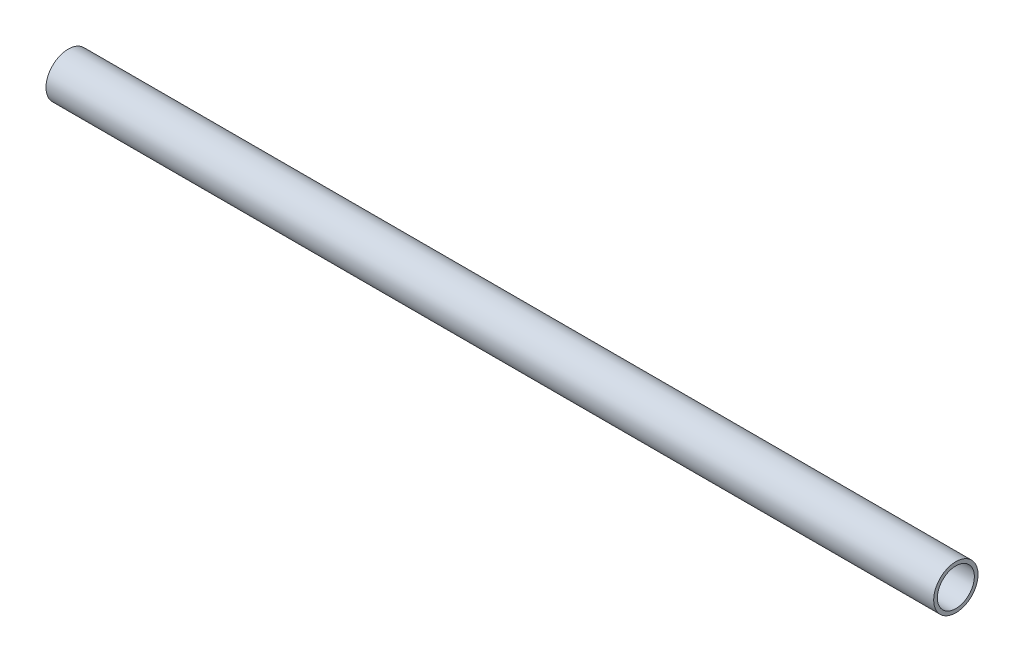
ISO-10303-21;
HEADER;
FILE_DESCRIPTION(('STEP AP214'),'2;1');
FILE_NAME('part.step','',(''),(''),'','','');
FILE_SCHEMA(('AUTOMOTIVE_DESIGN { 1 0 10303 214 1 1 1 1 }'));
ENDSEC;
DATA;
#1=APPLICATION_CONTEXT('core data for automotive mechanical design processes');
#2=APPLICATION_PROTOCOL_DEFINITION('international standard','automotive_design',2000,#1);
#3=PRODUCT_CONTEXT('',#1,'mechanical');
#4=PRODUCT('Part','Part','',(#3));
#5=PRODUCT_RELATED_PRODUCT_CATEGORY('part','',(#4));
#6=PRODUCT_DEFINITION_FORMATION('','',#4);
#7=PRODUCT_DEFINITION_CONTEXT('part definition',#1,'design');
#8=PRODUCT_DEFINITION('design','',#6,#7);
#9=PRODUCT_DEFINITION_SHAPE('','',#8);
#10=(LENGTH_UNIT() NAMED_UNIT(*) SI_UNIT(.MILLI.,.METRE.));
#11=(NAMED_UNIT(*) PLANE_ANGLE_UNIT() SI_UNIT($,.RADIAN.));
#12=(NAMED_UNIT(*) SI_UNIT($,.STERADIAN.) SOLID_ANGLE_UNIT());
#13=UNCERTAINTY_MEASURE_WITH_UNIT(LENGTH_MEASURE(1.E-05),#10,'distance_accuracy_value','');
#14=(GEOMETRIC_REPRESENTATION_CONTEXT(3) GLOBAL_UNCERTAINTY_ASSIGNED_CONTEXT((#13)) GLOBAL_UNIT_ASSIGNED_CONTEXT((#10,
#11,#12)) REPRESENTATION_CONTEXT('',''));
#15=CARTESIAN_POINT('',(0.,0.,0.));
#16=DIRECTION('',(0.,0.,1.));
#17=DIRECTION('',(1.,0.,0.));
#18=AXIS2_PLACEMENT_3D('',#15,#16,#17);
#19=CARTESIAN_POINT('',(0.,0.,-3.));
#20=DIRECTION('',(1.,0.,0.));
#21=DIRECTION('',(0.,0.,-1.));
#22=AXIS2_PLACEMENT_3D('',#19,#20,#21);
#23=PLANE('',#22);
#24=CARTESIAN_POINT('',(0.,0.,0.));
#25=DIRECTION('',(-1.,0.,0.));
#26=DIRECTION('',(0.,0.,1.));
#27=AXIS2_PLACEMENT_3D('',#24,#25,#26);
#28=CIRCLE('',#27,2.5);
#29=CARTESIAN_POINT('',(0.,0.,2.5));
#30=VERTEX_POINT('',#29);
#31=EDGE_CURVE('E10',#30,#30,#28,.T.);
#32=ORIENTED_EDGE('',*,*,#31,.F.);
#33=EDGE_LOOP('',(#32));
#34=FACE_BOUND('',#33,.T.);
#35=CARTESIAN_POINT('',(0.,0.,0.));
#36=DIRECTION('',(-1.,0.,0.));
#37=DIRECTION('',(0.,0.,1.));
#38=AXIS2_PLACEMENT_3D('',#35,#36,#37);
#39=CIRCLE('',#38,3.);
#40=CARTESIAN_POINT('',(0.,0.,3.));
#41=VERTEX_POINT('',#40);
#42=EDGE_CURVE('E45',#41,#41,#39,.T.);
#43=ORIENTED_EDGE('',*,*,#42,.T.);
#44=EDGE_LOOP('',(#43));
#45=FACE_BOUND('',#44,.T.);
#46=ADVANCED_FACE('F31',(#34,#45),#23,.F.);
#47=CARTESIAN_POINT('',(-0.956467940824351,0.,0.));
#48=DIRECTION('',(-1.,0.,0.));
#49=DIRECTION('',(0.,0.,1.));
#50=AXIS2_PLACEMENT_3D('',#47,#48,#49);
#51=CYLINDRICAL_SURFACE('',#50,2.5);
#52=CARTESIAN_POINT('',(120.,0.,0.));
#53=DIRECTION('',(-1.,0.,0.));
#54=DIRECTION('',(0.,0.,1.));
#55=AXIS2_PLACEMENT_3D('',#52,#53,#54);
#56=CIRCLE('',#55,2.5);
#57=CARTESIAN_POINT('',(120.,0.,2.5));
#58=VERTEX_POINT('',#57);
#59=EDGE_CURVE('E37',#58,#58,#56,.T.);
#60=ORIENTED_EDGE('',*,*,#59,.F.);
#61=EDGE_LOOP('',(#60));
#62=FACE_BOUND('',#61,.T.);
#63=ORIENTED_EDGE('',*,*,#31,.T.);
#64=EDGE_LOOP('',(#63));
#65=FACE_BOUND('',#64,.T.);
#66=ADVANCED_FACE('F60',(#62,#65),#51,.F.);
#67=CARTESIAN_POINT('',(120.,0.,-3.));
#68=DIRECTION('',(-1.,0.,0.));
#69=DIRECTION('',(0.,0.,1.));
#70=AXIS2_PLACEMENT_3D('',#67,#68,#69);
#71=PLANE('',#70);
#72=CARTESIAN_POINT('',(120.,0.,0.));
#73=DIRECTION('',(-1.,0.,0.));
#74=DIRECTION('',(0.,0.,1.));
#75=AXIS2_PLACEMENT_3D('',#72,#73,#74);
#76=CIRCLE('',#75,3.);
#77=CARTESIAN_POINT('',(120.,0.,3.));
#78=VERTEX_POINT('',#77);
#79=EDGE_CURVE('E41',#78,#78,#76,.T.);
#80=ORIENTED_EDGE('',*,*,#79,.F.);
#81=EDGE_LOOP('',(#80));
#82=FACE_BOUND('',#81,.T.);
#83=ORIENTED_EDGE('',*,*,#59,.T.);
#84=EDGE_LOOP('',(#83));
#85=FACE_BOUND('',#84,.T.);
#86=ADVANCED_FACE('F55',(#82,#85),#71,.F.);
#87=CARTESIAN_POINT('',(-0.956467940824351,0.,0.));
#88=DIRECTION('',(-1.,0.,0.));
#89=DIRECTION('',(0.,0.,1.));
#90=AXIS2_PLACEMENT_3D('',#87,#88,#89);
#91=CYLINDRICAL_SURFACE('',#90,3.);
#92=ORIENTED_EDGE('',*,*,#42,.F.);
#93=EDGE_LOOP('',(#92));
#94=FACE_BOUND('',#93,.T.);
#95=ORIENTED_EDGE('',*,*,#79,.T.);
#96=EDGE_LOOP('',(#95));
#97=FACE_BOUND('',#96,.T.);
#98=ADVANCED_FACE('F52',(#94,#97),#91,.T.);
#99=CLOSED_SHELL('',(#46,#66,#86,#98));
#100=MANIFOLD_SOLID_BREP('B2',#99);
#101=ADVANCED_BREP_SHAPE_REPRESENTATION('',(#18,#100),#14);
#102=SHAPE_DEFINITION_REPRESENTATION(#9,#101);
ENDSEC;
END-ISO-10303-21;
